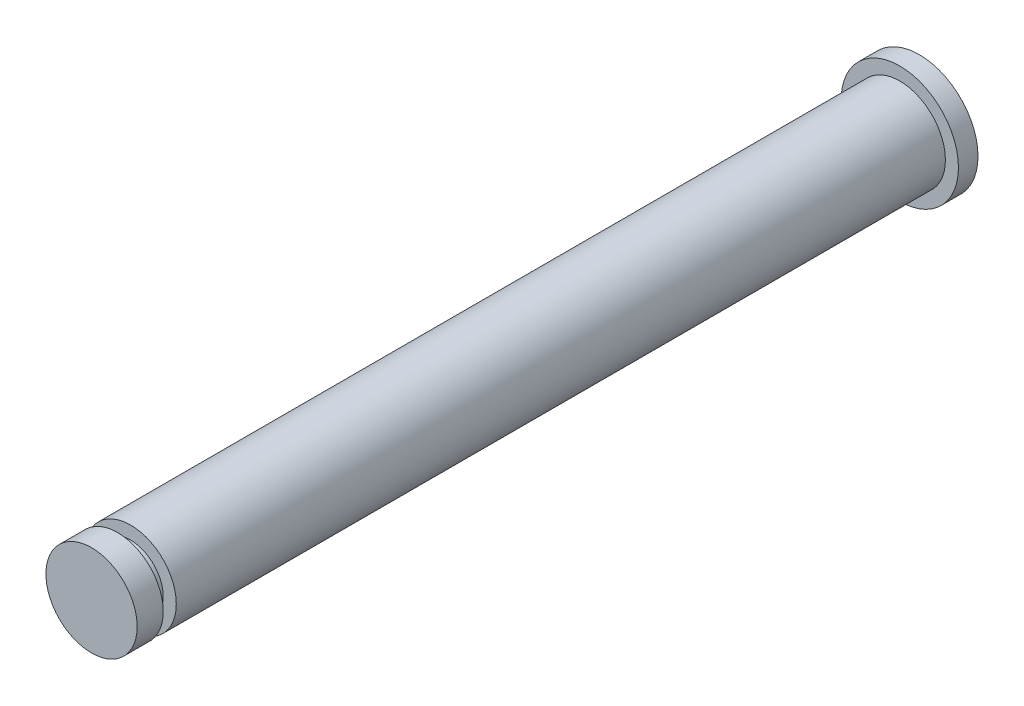
ISO-10303-21;
HEADER;
FILE_DESCRIPTION(('STEP AP214'),'2;1');
FILE_NAME('part.step','',(''),(''),'','','');
FILE_SCHEMA(('AUTOMOTIVE_DESIGN { 1 0 10303 214 1 1 1 1 }'));
ENDSEC;
DATA;
#1=APPLICATION_CONTEXT('core data for automotive mechanical design processes');
#2=APPLICATION_PROTOCOL_DEFINITION('international standard','automotive_design',2000,#1);
#3=PRODUCT_CONTEXT('',#1,'mechanical');
#4=PRODUCT('Part','Part','',(#3));
#5=PRODUCT_RELATED_PRODUCT_CATEGORY('part','',(#4));
#6=PRODUCT_DEFINITION_FORMATION('','',#4);
#7=PRODUCT_DEFINITION_CONTEXT('part definition',#1,'design');
#8=PRODUCT_DEFINITION('design','',#6,#7);
#9=PRODUCT_DEFINITION_SHAPE('','',#8);
#10=(LENGTH_UNIT() NAMED_UNIT(*) SI_UNIT(.MILLI.,.METRE.));
#11=(NAMED_UNIT(*) PLANE_ANGLE_UNIT() SI_UNIT($,.RADIAN.));
#12=(NAMED_UNIT(*) SI_UNIT($,.STERADIAN.) SOLID_ANGLE_UNIT());
#13=UNCERTAINTY_MEASURE_WITH_UNIT(LENGTH_MEASURE(1.E-05),#10,'distance_accuracy_value','');
#14=(GEOMETRIC_REPRESENTATION_CONTEXT(3) GLOBAL_UNCERTAINTY_ASSIGNED_CONTEXT((#13)) GLOBAL_UNIT_ASSIGNED_CONTEXT((#10,
#11,#12)) REPRESENTATION_CONTEXT('',''));
#15=CARTESIAN_POINT('',(0.,0.,0.));
#16=DIRECTION('',(0.,0.,1.));
#17=DIRECTION('',(1.,0.,0.));
#18=AXIS2_PLACEMENT_3D('',#15,#16,#17);
#19=CARTESIAN_POINT('',(0.,0.,0.));
#20=DIRECTION('',(0.,0.,-1.));
#21=DIRECTION('',(-1.,0.,0.));
#22=AXIS2_PLACEMENT_3D('',#19,#20,#21);
#23=PLANE('',#22);
#24=CARTESIAN_POINT('',(0.,0.,0.));
#25=DIRECTION('',(0.,0.,1.));
#26=DIRECTION('',(1.,0.,0.));
#27=AXIS2_PLACEMENT_3D('',#24,#25,#26);
#28=CIRCLE('',#27,3.5);
#29=CARTESIAN_POINT('',(3.5,0.,0.));
#30=VERTEX_POINT('',#29);
#31=EDGE_CURVE('E10',#30,#30,#28,.T.);
#32=ORIENTED_EDGE('',*,*,#31,.T.);
#33=EDGE_LOOP('',(#32));
#34=FACE_BOUND('',#33,.T.);
#35=ADVANCED_FACE('F34',(#34),#23,.F.);
#36=CARTESIAN_POINT('',(0.,0.,0.));
#37=DIRECTION('',(0.,0.,1.));
#38=DIRECTION('',(1.,0.,0.));
#39=AXIS2_PLACEMENT_3D('',#36,#37,#38);
#40=CYLINDRICAL_SURFACE('',#39,3.5);
#41=ORIENTED_EDGE('',*,*,#31,.F.);
#42=EDGE_LOOP('',(#41));
#43=FACE_BOUND('',#42,.T.);
#44=CARTESIAN_POINT('',(0.,0.,-2.));
#45=DIRECTION('',(0.,0.,1.));
#46=DIRECTION('',(1.,0.,0.));
#47=AXIS2_PLACEMENT_3D('',#44,#45,#46);
#48=CIRCLE('',#47,3.5);
#49=CARTESIAN_POINT('',(3.5,0.,-2.));
#50=VERTEX_POINT('',#49);
#51=EDGE_CURVE('E40',#50,#50,#48,.T.);
#52=ORIENTED_EDGE('',*,*,#51,.T.);
#53=EDGE_LOOP('',(#52));
#54=FACE_BOUND('',#53,.T.);
#55=ADVANCED_FACE('F78',(#43,#54),#40,.T.);
#56=CARTESIAN_POINT('',(0.,3.5,-2.));
#57=DIRECTION('',(0.,0.,1.));
#58=DIRECTION('',(1.,0.,0.));
#59=AXIS2_PLACEMENT_3D('',#56,#57,#58);
#60=PLANE('',#59);
#61=ORIENTED_EDGE('',*,*,#51,.F.);
#62=EDGE_LOOP('',(#61));
#63=FACE_BOUND('',#62,.T.);
#64=CARTESIAN_POINT('',(0.,0.,-2.));
#65=DIRECTION('',(0.,0.,1.));
#66=DIRECTION('',(1.,0.,0.));
#67=AXIS2_PLACEMENT_3D('',#64,#65,#66);
#68=CIRCLE('',#67,2.5);
#69=CARTESIAN_POINT('',(2.5,0.,-2.));
#70=VERTEX_POINT('',#69);
#71=EDGE_CURVE('E44',#70,#70,#68,.T.);
#72=ORIENTED_EDGE('',*,*,#71,.T.);
#73=EDGE_LOOP('',(#72));
#74=FACE_BOUND('',#73,.T.);
#75=ADVANCED_FACE('F82',(#63,#74),#60,.F.);
#76=CARTESIAN_POINT('',(0.,0.,0.));
#77=DIRECTION('',(0.,0.,1.));
#78=DIRECTION('',(1.,0.,0.));
#79=AXIS2_PLACEMENT_3D('',#76,#77,#78);
#80=CYLINDRICAL_SURFACE('',#79,2.5);
#81=ORIENTED_EDGE('',*,*,#71,.F.);
#82=EDGE_LOOP('',(#81));
#83=FACE_BOUND('',#82,.T.);
#84=CARTESIAN_POINT('',(0.,0.,-3.));
#85=DIRECTION('',(0.,0.,1.));
#86=DIRECTION('',(1.,0.,0.));
#87=AXIS2_PLACEMENT_3D('',#84,#85,#86);
#88=CIRCLE('',#87,2.5);
#89=CARTESIAN_POINT('',(2.5,0.,-3.));
#90=VERTEX_POINT('',#89);
#91=EDGE_CURVE('E48',#90,#90,#88,.T.);
#92=ORIENTED_EDGE('',*,*,#91,.T.);
#93=EDGE_LOOP('',(#92));
#94=FACE_BOUND('',#93,.T.);
#95=ADVANCED_FACE('F87',(#83,#94),#80,.T.);
#96=CARTESIAN_POINT('',(0.,3.5,-3.));
#97=DIRECTION('',(0.,0.,-1.));
#98=DIRECTION('',(-1.,0.,0.));
#99=AXIS2_PLACEMENT_3D('',#96,#97,#98);
#100=PLANE('',#99);
#101=ORIENTED_EDGE('',*,*,#91,.F.);
#102=EDGE_LOOP('',(#101));
#103=FACE_BOUND('',#102,.T.);
#104=CARTESIAN_POINT('',(0.,0.,-3.));
#105=DIRECTION('',(0.,0.,1.));
#106=DIRECTION('',(1.,0.,0.));
#107=AXIS2_PLACEMENT_3D('',#104,#105,#106);
#108=CIRCLE('',#107,3.5);
#109=CARTESIAN_POINT('',(3.5,0.,-3.));
#110=VERTEX_POINT('',#109);
#111=EDGE_CURVE('E53',#110,#110,#108,.T.);
#112=ORIENTED_EDGE('',*,*,#111,.T.);
#113=EDGE_LOOP('',(#112));
#114=FACE_BOUND('',#113,.T.);
#115=ADVANCED_FACE('F93',(#103,#114),#100,.F.);
#116=CARTESIAN_POINT('',(0.,0.,0.));
#117=DIRECTION('',(0.,0.,1.));
#118=DIRECTION('',(1.,0.,0.));
#119=AXIS2_PLACEMENT_3D('',#116,#117,#118);
#120=CYLINDRICAL_SURFACE('',#119,3.5);
#121=ORIENTED_EDGE('',*,*,#111,.F.);
#122=EDGE_LOOP('',(#121));
#123=FACE_BOUND('',#122,.T.);
#124=CARTESIAN_POINT('',(0.,0.,-62.));
#125=DIRECTION('',(0.,0.,1.));
#126=DIRECTION('',(1.,0.,0.));
#127=AXIS2_PLACEMENT_3D('',#124,#125,#126);
#128=CIRCLE('',#127,3.5);
#129=CARTESIAN_POINT('',(3.5,0.,-62.));
#130=VERTEX_POINT('',#129);
#131=EDGE_CURVE('E56',#130,#130,#128,.T.);
#132=ORIENTED_EDGE('',*,*,#131,.T.);
#133=EDGE_LOOP('',(#132));
#134=FACE_BOUND('',#133,.T.);
#135=ADVANCED_FACE('F97',(#123,#134),#120,.T.);
#136=CARTESIAN_POINT('',(0.,3.5,-62.));
#137=DIRECTION('',(0.,0.,-1.));
#138=DIRECTION('',(-1.,0.,0.));
#139=AXIS2_PLACEMENT_3D('',#136,#137,#138);
#140=PLANE('',#139);
#141=ORIENTED_EDGE('',*,*,#131,.F.);
#142=EDGE_LOOP('',(#141));
#143=FACE_BOUND('',#142,.T.);
#144=CARTESIAN_POINT('',(0.,0.,-62.));
#145=DIRECTION('',(0.,0.,1.));
#146=DIRECTION('',(1.,0.,0.));
#147=AXIS2_PLACEMENT_3D('',#144,#145,#146);
#148=CIRCLE('',#147,4.5);
#149=CARTESIAN_POINT('',(4.5,0.,-62.));
#150=VERTEX_POINT('',#149);
#151=EDGE_CURVE('E59',#150,#150,#148,.T.);
#152=ORIENTED_EDGE('',*,*,#151,.T.);
#153=EDGE_LOOP('',(#152));
#154=FACE_BOUND('',#153,.T.);
#155=ADVANCED_FACE('F74',(#143,#154),#140,.F.);
#156=CARTESIAN_POINT('',(0.,0.,0.));
#157=DIRECTION('',(0.,0.,1.));
#158=DIRECTION('',(1.,0.,0.));
#159=AXIS2_PLACEMENT_3D('',#156,#157,#158);
#160=CYLINDRICAL_SURFACE('',#159,4.5);
#161=ORIENTED_EDGE('',*,*,#151,.F.);
#162=EDGE_LOOP('',(#161));
#163=FACE_BOUND('',#162,.T.);
#164=CARTESIAN_POINT('',(0.,0.,-63.5));
#165=DIRECTION('',(0.,0.,1.));
#166=DIRECTION('',(1.,0.,0.));
#167=AXIS2_PLACEMENT_3D('',#164,#165,#166);
#168=CIRCLE('',#167,4.5);
#169=CARTESIAN_POINT('',(4.5,0.,-63.5));
#170=VERTEX_POINT('',#169);
#171=EDGE_CURVE('E62',#170,#170,#168,.T.);
#172=ORIENTED_EDGE('',*,*,#171,.T.);
#173=EDGE_LOOP('',(#172));
#174=FACE_BOUND('',#173,.T.);
#175=ADVANCED_FACE('F66',(#163,#174),#160,.T.);
#176=CARTESIAN_POINT('',(0.,4.5,-63.5));
#177=DIRECTION('',(0.,0.,1.));
#178=DIRECTION('',(1.,0.,0.));
#179=AXIS2_PLACEMENT_3D('',#176,#177,#178);
#180=PLANE('',#179);
#181=ORIENTED_EDGE('',*,*,#171,.F.);
#182=EDGE_LOOP('',(#181));
#183=FACE_BOUND('',#182,.T.);
#184=ADVANCED_FACE('F68',(#183),#180,.F.);
#185=CLOSED_SHELL('',(#35,#55,#75,#95,#115,#135,#155,#175,#184));
#186=MANIFOLD_SOLID_BREP('B2',#185);
#187=ADVANCED_BREP_SHAPE_REPRESENTATION('',(#18,#186),#14);
#188=SHAPE_DEFINITION_REPRESENTATION(#9,#187);
ENDSEC;
END-ISO-10303-21;
